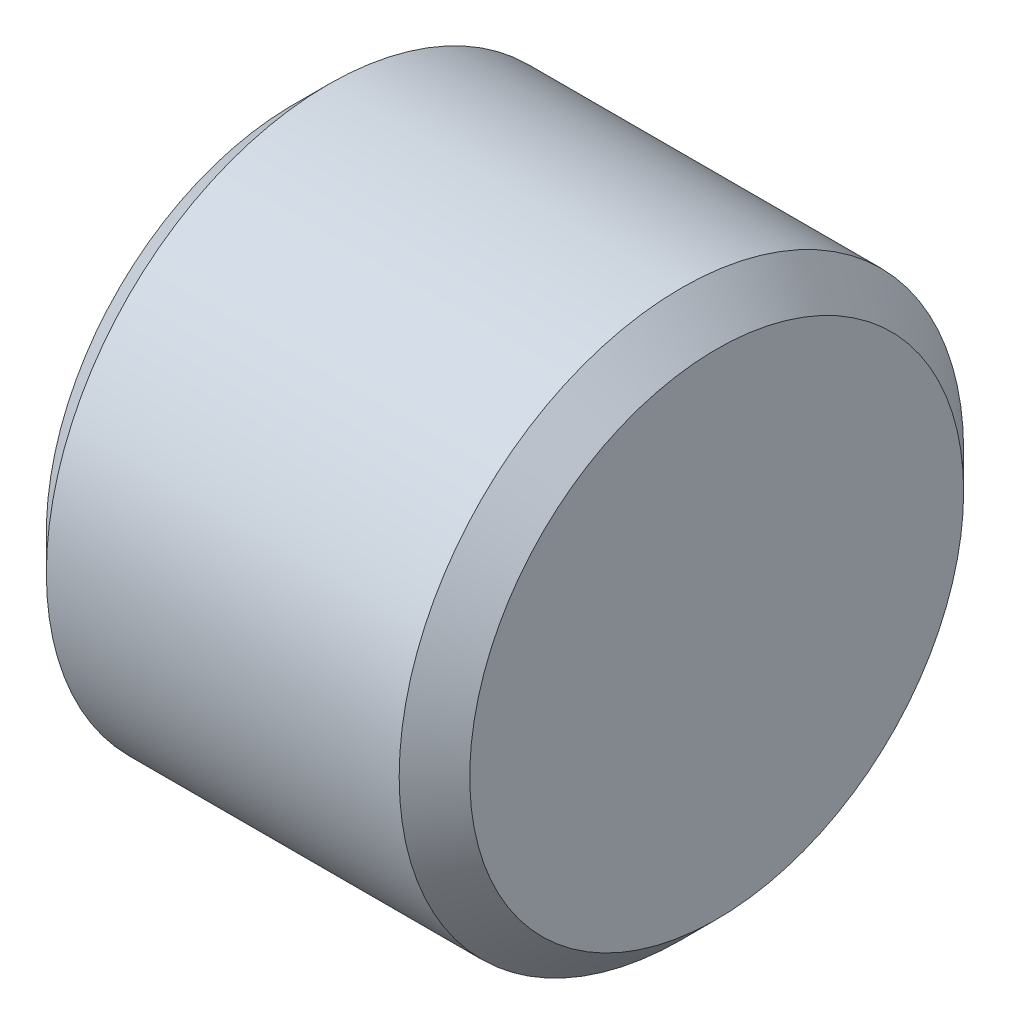
ISO-10303-21;
HEADER;
FILE_DESCRIPTION(('STEP AP214'),'2;1');
FILE_NAME('part.step','',(''),(''),'','','');
FILE_SCHEMA(('AUTOMOTIVE_DESIGN { 1 0 10303 214 1 1 1 1 }'));
ENDSEC;
DATA;
#1=APPLICATION_CONTEXT('core data for automotive mechanical design processes');
#2=APPLICATION_PROTOCOL_DEFINITION('international standard','automotive_design',2000,#1);
#3=PRODUCT_CONTEXT('',#1,'mechanical');
#4=PRODUCT('Part','Part','',(#3));
#5=PRODUCT_RELATED_PRODUCT_CATEGORY('part','',(#4));
#6=PRODUCT_DEFINITION_FORMATION('','',#4);
#7=PRODUCT_DEFINITION_CONTEXT('part definition',#1,'design');
#8=PRODUCT_DEFINITION('design','',#6,#7);
#9=PRODUCT_DEFINITION_SHAPE('','',#8);
#10=(LENGTH_UNIT() NAMED_UNIT(*) SI_UNIT(.MILLI.,.METRE.));
#11=(NAMED_UNIT(*) PLANE_ANGLE_UNIT() SI_UNIT($,.RADIAN.));
#12=(NAMED_UNIT(*) SI_UNIT($,.STERADIAN.) SOLID_ANGLE_UNIT());
#13=UNCERTAINTY_MEASURE_WITH_UNIT(LENGTH_MEASURE(1.E-05),#10,'distance_accuracy_value','');
#14=(GEOMETRIC_REPRESENTATION_CONTEXT(3) GLOBAL_UNCERTAINTY_ASSIGNED_CONTEXT((#13)) GLOBAL_UNIT_ASSIGNED_CONTEXT((#10,
#11,#12)) REPRESENTATION_CONTEXT('',''));
#15=CARTESIAN_POINT('',(0.,0.,0.));
#16=DIRECTION('',(0.,0.,1.));
#17=DIRECTION('',(1.,0.,0.));
#18=AXIS2_PLACEMENT_3D('',#15,#16,#17);
#19=CARTESIAN_POINT('',(6.,0.,0.));
#20=DIRECTION('',(-1.,0.,0.));
#21=DIRECTION('',(0.,0.,1.));
#22=AXIS2_PLACEMENT_3D('',#19,#20,#21);
#23=CYLINDRICAL_SURFACE('',#22,4.);
#24=CARTESIAN_POINT('',(0.500000000000001,0.,0.));
#25=DIRECTION('',(1.,0.,0.));
#26=DIRECTION('',(0.,0.,-1.));
#27=AXIS2_PLACEMENT_3D('',#24,#25,#26);
#28=CIRCLE('',#27,4.);
#29=CARTESIAN_POINT('',(0.500000000000001,0.,-4.));
#30=VERTEX_POINT('',#29);
#31=EDGE_CURVE('E51',#30,#30,#28,.T.);
#32=ORIENTED_EDGE('',*,*,#31,.T.);
#33=EDGE_LOOP('',(#32));
#34=FACE_BOUND('',#33,.T.);
#35=CARTESIAN_POINT('',(5.5,0.,0.));
#36=DIRECTION('',(1.,0.,0.));
#37=DIRECTION('',(0.,0.,-1.));
#38=AXIS2_PLACEMENT_3D('',#35,#36,#37);
#39=CIRCLE('',#38,4.);
#40=CARTESIAN_POINT('',(5.5,0.,-4.));
#41=VERTEX_POINT('',#40);
#42=EDGE_CURVE('E55',#41,#41,#39,.F.);
#43=ORIENTED_EDGE('',*,*,#42,.T.);
#44=EDGE_LOOP('',(#43));
#45=FACE_BOUND('',#44,.T.);
#46=ADVANCED_FACE('F39',(#34,#45),#23,.T.);
#47=CARTESIAN_POINT('',(6.,0.,0.));
#48=DIRECTION('',(1.,0.,0.));
#49=DIRECTION('',(0.,0.,-1.));
#50=AXIS2_PLACEMENT_3D('',#47,#48,#49);
#51=PLANE('',#50);
#52=CARTESIAN_POINT('',(6.,0.,0.));
#53=DIRECTION('',(1.,0.,0.));
#54=DIRECTION('',(0.,0.,-1.));
#55=AXIS2_PLACEMENT_3D('',#52,#53,#54);
#56=CIRCLE('',#55,3.5);
#57=CARTESIAN_POINT('',(6.,0.,-3.5));
#58=VERTEX_POINT('',#57);
#59=EDGE_CURVE('E10',#58,#58,#56,.T.);
#60=ORIENTED_EDGE('',*,*,#59,.T.);
#61=EDGE_LOOP('',(#60));
#62=FACE_BOUND('',#61,.T.);
#63=ADVANCED_FACE('F71',(#62),#51,.T.);
#64=CARTESIAN_POINT('',(0.,0.,0.));
#65=DIRECTION('',(1.,0.,0.));
#66=DIRECTION('',(0.,0.,-1.));
#67=AXIS2_PLACEMENT_3D('',#64,#65,#66);
#68=PLANE('',#67);
#69=CARTESIAN_POINT('',(0.,0.,0.));
#70=DIRECTION('',(1.,0.,0.));
#71=DIRECTION('',(0.,0.,-1.));
#72=AXIS2_PLACEMENT_3D('',#69,#70,#71);
#73=CIRCLE('',#72,3.5);
#74=CARTESIAN_POINT('',(0.,0.,-3.5));
#75=VERTEX_POINT('',#74);
#76=EDGE_CURVE('E47',#75,#75,#73,.F.);
#77=ORIENTED_EDGE('',*,*,#76,.T.);
#78=EDGE_LOOP('',(#77));
#79=FACE_BOUND('',#78,.T.);
#80=ADVANCED_FACE('F68',(#79),#68,.F.);
#81=CARTESIAN_POINT('',(0.500000000000001,0.,0.));
#82=DIRECTION('',(1.,0.,0.));
#83=DIRECTION('',(0.,0.,-1.));
#84=AXIS2_PLACEMENT_3D('',#81,#82,#83);
#85=CONICAL_SURFACE('',#84,4.,0.785398163397451);
#86=ORIENTED_EDGE('',*,*,#76,.F.);
#87=EDGE_LOOP('',(#86));
#88=FACE_BOUND('',#87,.T.);
#89=ORIENTED_EDGE('',*,*,#31,.F.);
#90=EDGE_LOOP('',(#89));
#91=FACE_BOUND('',#90,.T.);
#92=ADVANCED_FACE('F64',(#88,#91),#85,.T.);
#93=CARTESIAN_POINT('',(6.,0.,0.));
#94=DIRECTION('',(-1.,0.,0.));
#95=DIRECTION('',(0.,0.,1.));
#96=AXIS2_PLACEMENT_3D('',#93,#94,#95);
#97=CONICAL_SURFACE('',#96,3.5,0.785398163397447);
#98=ORIENTED_EDGE('',*,*,#42,.F.);
#99=EDGE_LOOP('',(#98));
#100=FACE_BOUND('',#99,.T.);
#101=ORIENTED_EDGE('',*,*,#59,.F.);
#102=EDGE_LOOP('',(#101));
#103=FACE_BOUND('',#102,.T.);
#104=ADVANCED_FACE('F42',(#100,#103),#97,.T.);
#105=CLOSED_SHELL('',(#46,#63,#80,#92,#104));
#106=MANIFOLD_SOLID_BREP('B2',#105);
#107=ADVANCED_BREP_SHAPE_REPRESENTATION('',(#18,#106),#14);
#108=SHAPE_DEFINITION_REPRESENTATION(#9,#107);
ENDSEC;
END-ISO-10303-21;
